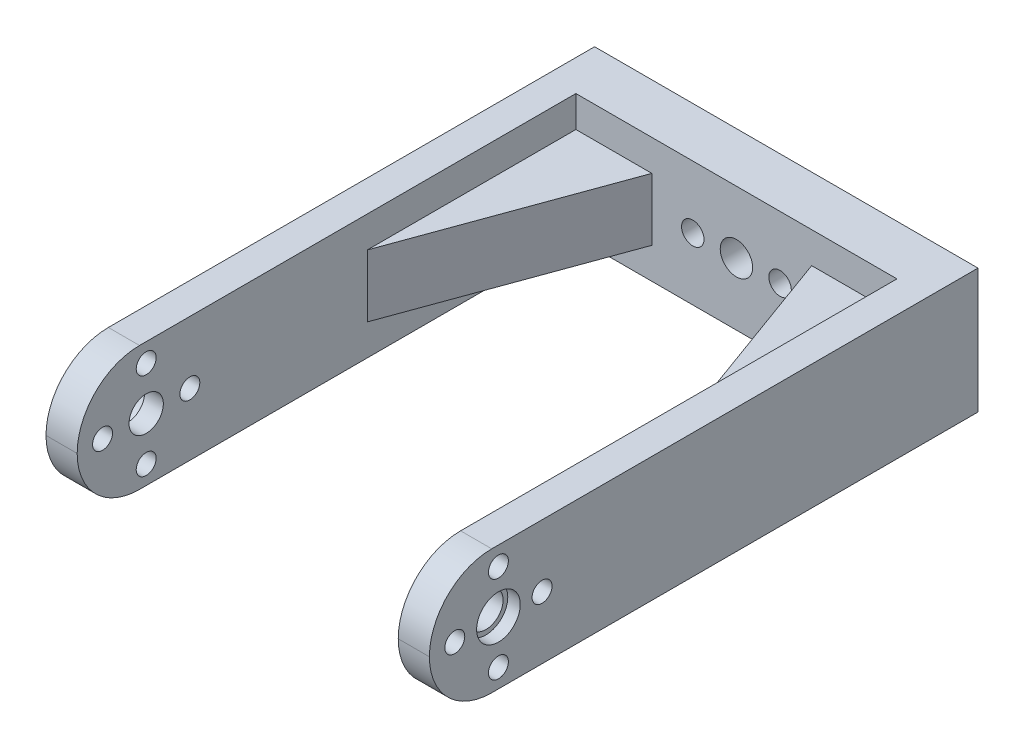
ISO-10303-21;
HEADER;
FILE_DESCRIPTION(('STEP AP214'),'2;1');
FILE_NAME('part.step','',(''),(''),'','','');
FILE_SCHEMA(('AUTOMOTIVE_DESIGN { 1 0 10303 214 1 1 1 1 }'));
ENDSEC;
DATA;
#1=APPLICATION_CONTEXT('core data for automotive mechanical design processes');
#2=APPLICATION_PROTOCOL_DEFINITION('international standard','automotive_design',2000,#1);
#3=PRODUCT_CONTEXT('',#1,'mechanical');
#4=PRODUCT('Part','Part','',(#3));
#5=PRODUCT_RELATED_PRODUCT_CATEGORY('part','',(#4));
#6=PRODUCT_DEFINITION_FORMATION('','',#4);
#7=PRODUCT_DEFINITION_CONTEXT('part definition',#1,'design');
#8=PRODUCT_DEFINITION('design','',#6,#7);
#9=PRODUCT_DEFINITION_SHAPE('','',#8);
#10=(LENGTH_UNIT() NAMED_UNIT(*) SI_UNIT(.MILLI.,.METRE.));
#11=(NAMED_UNIT(*) PLANE_ANGLE_UNIT() SI_UNIT($,.RADIAN.));
#12=(NAMED_UNIT(*) SI_UNIT($,.STERADIAN.) SOLID_ANGLE_UNIT());
#13=UNCERTAINTY_MEASURE_WITH_UNIT(LENGTH_MEASURE(1.E-05),#10,'distance_accuracy_value','');
#14=(GEOMETRIC_REPRESENTATION_CONTEXT(3) GLOBAL_UNCERTAINTY_ASSIGNED_CONTEXT((#13)) GLOBAL_UNIT_ASSIGNED_CONTEXT((#10,
#11,#12)) REPRESENTATION_CONTEXT('',''));
#15=CARTESIAN_POINT('',(0.,0.,0.));
#16=DIRECTION('',(0.,0.,1.));
#17=DIRECTION('',(1.,0.,0.));
#18=AXIS2_PLACEMENT_3D('',#15,#16,#17);
#19=CARTESIAN_POINT('',(-23.5,10.,68.9278748806243));
#20=DIRECTION('',(1.,0.,0.));
#21=DIRECTION('',(0.,0.,-1.));
#22=AXIS2_PLACEMENT_3D('',#19,#20,#21);
#23=CYLINDRICAL_SURFACE('',#22,2.75000000000001);
#24=CARTESIAN_POINT('',(5.,10.,68.9278748806243));
#25=DIRECTION('',(1.,0.,0.));
#26=DIRECTION('',(0.,1.,0.));
#27=AXIS2_PLACEMENT_3D('',#24,#25,#26);
#28=CIRCLE('',#27,2.75000000000001);
#29=CARTESIAN_POINT('',(5.,12.75,68.9278748806243));
#30=VERTEX_POINT('',#29);
#31=EDGE_CURVE('E258',#30,#30,#28,.T.);
#32=ORIENTED_EDGE('',*,*,#31,.T.);
#33=EDGE_LOOP('',(#32));
#34=FACE_BOUND('',#33,.T.);
#35=CARTESIAN_POINT('',(2.,10.,68.9278748806243));
#36=DIRECTION('',(-1.,0.,0.));
#37=DIRECTION('',(0.,0.,1.));
#38=AXIS2_PLACEMENT_3D('',#35,#36,#37);
#39=CIRCLE('',#38,2.75000000000001);
#40=CARTESIAN_POINT('',(2.,10.,71.6778748806243));
#41=VERTEX_POINT('',#40);
#42=EDGE_CURVE('E49',#41,#41,#39,.F.);
#43=ORIENTED_EDGE('',*,*,#42,.F.);
#44=EDGE_LOOP('',(#43));
#45=FACE_BOUND('',#44,.T.);
#46=ADVANCED_FACE('F45',(#34,#45),#23,.F.);
#47=CARTESIAN_POINT('',(56.5,10.,68.9278748806243));
#48=DIRECTION('',(1.,0.,0.));
#49=DIRECTION('',(0.,0.,-1.));
#50=AXIS2_PLACEMENT_3D('',#47,#48,#49);
#51=CIRCLE('',#50,2.75000000000001);
#52=CARTESIAN_POINT('',(56.5,10.,66.1778748806243));
#53=VERTEX_POINT('',#52);
#54=EDGE_CURVE('E257',#53,#53,#51,.T.);
#55=ORIENTED_EDGE('',*,*,#54,.F.);
#56=EDGE_LOOP('',(#55));
#57=FACE_BOUND('',#56,.T.);
#58=CARTESIAN_POINT('',(59.5,10.,68.9278748806243));
#59=DIRECTION('',(1.,0.,0.));
#60=DIRECTION('',(0.,0.,-1.));
#61=AXIS2_PLACEMENT_3D('',#58,#59,#60);
#62=CIRCLE('',#61,2.75000000000001);
#63=CARTESIAN_POINT('',(59.5,10.,66.1778748806243));
#64=VERTEX_POINT('',#63);
#65=EDGE_CURVE('E174',#64,#64,#62,.F.);
#66=ORIENTED_EDGE('',*,*,#65,.F.);
#67=EDGE_LOOP('',(#66));
#68=FACE_BOUND('',#67,.T.);
#69=ADVANCED_FACE('F376',(#57,#68),#23,.F.);
#70=CARTESIAN_POINT('',(0.,0.,0.));
#71=DIRECTION('',(0.,0.,-1.));
#72=DIRECTION('',(-1.,0.,0.));
#73=AXIS2_PLACEMENT_3D('',#70,#71,#72);
#74=PLANE('',#73);
#75=CARTESIAN_POINT('',(37.75,10.,0.));
#76=DIRECTION('',(0.,0.,-1.));
#77=DIRECTION('',(-1.,0.,0.));
#78=AXIS2_PLACEMENT_3D('',#75,#76,#77);
#79=CIRCLE('',#78,1.8);
#80=CARTESIAN_POINT('',(35.95,10.,0.));
#81=VERTEX_POINT('',#80);
#82=EDGE_CURVE('E254',#81,#81,#79,.T.);
#83=ORIENTED_EDGE('',*,*,#82,.T.);
#84=EDGE_LOOP('',(#83));
#85=FACE_BOUND('',#84,.T.);
#86=CARTESIAN_POINT('',(30.75,10.,0.));
#87=DIRECTION('',(0.,0.,-1.));
#88=DIRECTION('',(-1.,0.,0.));
#89=AXIS2_PLACEMENT_3D('',#86,#87,#88);
#90=CIRCLE('',#89,2.6);
#91=CARTESIAN_POINT('',(28.15,10.,0.));
#92=VERTEX_POINT('',#91);
#93=EDGE_CURVE('E248',#92,#92,#90,.T.);
#94=ORIENTED_EDGE('',*,*,#93,.T.);
#95=EDGE_LOOP('',(#94));
#96=FACE_BOUND('',#95,.T.);
#97=DIRECTION('',(0.,-1.,0.));
#98=VECTOR('',#97,1.);
#99=CARTESIAN_POINT('',(17.1808057330266,0.,0.));
#100=LINE('',#99,#98);
#101=CARTESIAN_POINT('',(17.1808057330266,15.,0.));
#102=VERTEX_POINT('',#101);
#103=CARTESIAN_POINT('',(17.1808057330266,5.,0.));
#104=VERTEX_POINT('',#103);
#105=EDGE_CURVE('E162',#102,#104,#100,.T.);
#106=ORIENTED_EDGE('',*,*,#105,.T.);
#107=DIRECTION('',(-1.,0.,0.));
#108=VECTOR('',#107,1.);
#109=CARTESIAN_POINT('',(0.,5.,0.));
#110=LINE('',#109,#108);
#111=CARTESIAN_POINT('',(5.,5.,0.));
#112=VERTEX_POINT('',#111);
#113=EDGE_CURVE('E170',#104,#112,#110,.T.);
#114=ORIENTED_EDGE('',*,*,#113,.T.);
#115=DIRECTION('',(0.,-1.,0.));
#116=VECTOR('',#115,1.);
#117=CARTESIAN_POINT('',(5.,0.,0.));
#118=LINE('',#117,#116);
#119=CARTESIAN_POINT('',(5.,0.,0.));
#120=VERTEX_POINT('',#119);
#121=EDGE_CURVE('E291',#112,#120,#118,.T.);
#122=ORIENTED_EDGE('',*,*,#121,.T.);
#123=DIRECTION('',(1.,0.,0.));
#124=VECTOR('',#123,1.);
#125=CARTESIAN_POINT('',(0.,0.,0.));
#126=LINE('',#125,#124);
#127=CARTESIAN_POINT('',(56.5,0.,0.));
#128=VERTEX_POINT('',#127);
#129=EDGE_CURVE('E273',#120,#128,#126,.T.);
#130=ORIENTED_EDGE('',*,*,#129,.T.);
#131=DIRECTION('',(0.,-1.,0.));
#132=VECTOR('',#131,1.);
#133=CARTESIAN_POINT('',(56.5,0.,0.));
#134=LINE('',#133,#132);
#135=CARTESIAN_POINT('',(56.5,5.,0.));
#136=VERTEX_POINT('',#135);
#137=EDGE_CURVE('E261',#136,#128,#134,.T.);
#138=ORIENTED_EDGE('',*,*,#137,.F.);
#139=DIRECTION('',(-1.,0.,0.));
#140=VECTOR('',#139,1.);
#141=CARTESIAN_POINT('',(0.,5.,0.));
#142=LINE('',#141,#140);
#143=CARTESIAN_POINT('',(42.8191942669734,5.,0.));
#144=VERTEX_POINT('',#143);
#145=EDGE_CURVE('E70',#136,#144,#142,.T.);
#146=ORIENTED_EDGE('',*,*,#145,.T.);
#147=DIRECTION('',(0.,-1.,0.));
#148=VECTOR('',#147,1.);
#149=CARTESIAN_POINT('',(42.8191942669734,0.,0.));
#150=LINE('',#149,#148);
#151=CARTESIAN_POINT('',(42.8191942669734,15.,0.));
#152=VERTEX_POINT('',#151);
#153=EDGE_CURVE('E195',#144,#152,#150,.F.);
#154=ORIENTED_EDGE('',*,*,#153,.T.);
#155=DIRECTION('',(-1.,0.,0.));
#156=VECTOR('',#155,1.);
#157=CARTESIAN_POINT('',(0.,15.,0.));
#158=LINE('',#157,#156);
#159=CARTESIAN_POINT('',(56.5,15.,0.));
#160=VERTEX_POINT('',#159);
#161=EDGE_CURVE('E189',#160,#152,#158,.T.);
#162=ORIENTED_EDGE('',*,*,#161,.F.);
#163=CARTESIAN_POINT('',(56.5,20.,0.));
#164=VERTEX_POINT('',#163);
#165=EDGE_CURVE('E262',#164,#160,#134,.T.);
#166=ORIENTED_EDGE('',*,*,#165,.F.);
#167=DIRECTION('',(1.,0.,0.));
#168=VECTOR('',#167,1.);
#169=CARTESIAN_POINT('',(0.,20.,0.));
#170=LINE('',#169,#168);
#171=CARTESIAN_POINT('',(5.,20.,0.));
#172=VERTEX_POINT('',#171);
#173=EDGE_CURVE('E269',#172,#164,#170,.T.);
#174=ORIENTED_EDGE('',*,*,#173,.F.);
#175=CARTESIAN_POINT('',(5.,15.,0.));
#176=VERTEX_POINT('',#175);
#177=EDGE_CURVE('E181',#172,#176,#118,.T.);
#178=ORIENTED_EDGE('',*,*,#177,.T.);
#179=DIRECTION('',(-1.,0.,0.));
#180=VECTOR('',#179,1.);
#181=CARTESIAN_POINT('',(0.,15.,0.));
#182=LINE('',#181,#180);
#183=EDGE_CURVE('E62',#102,#176,#182,.T.);
#184=ORIENTED_EDGE('',*,*,#183,.F.);
#185=EDGE_LOOP('',(#106,#114,#122,#130,#138,#146,#154,#162,#166,#174,#178,#184));
#186=FACE_BOUND('',#185,.T.);
#187=CARTESIAN_POINT('',(23.75,10.,0.));
#188=DIRECTION('',(0.,0.,-1.));
#189=DIRECTION('',(-1.,0.,0.));
#190=AXIS2_PLACEMENT_3D('',#187,#188,#189);
#191=CIRCLE('',#190,1.8);
#192=CARTESIAN_POINT('',(21.95,10.,0.));
#193=VERTEX_POINT('',#192);
#194=EDGE_CURVE('E251',#193,#193,#191,.F.);
#195=ORIENTED_EDGE('',*,*,#194,.F.);
#196=EDGE_LOOP('',(#195));
#197=FACE_BOUND('',#196,.T.);
#198=ADVANCED_FACE('F177',(#85,#96,#186,#197),#74,.F.);
#199=CARTESIAN_POINT('',(0.,0.,-8.));
#200=DIRECTION('',(0.,0.,-1.));
#201=DIRECTION('',(-1.,0.,0.));
#202=AXIS2_PLACEMENT_3D('',#199,#200,#201);
#203=PLANE('',#202);
#204=DIRECTION('',(0.,1.,0.));
#205=VECTOR('',#204,1.);
#206=CARTESIAN_POINT('',(0.,0.,-8.));
#207=LINE('',#206,#205);
#208=CARTESIAN_POINT('',(0.,0.,-8.));
#209=VERTEX_POINT('',#208);
#210=CARTESIAN_POINT('',(0.,20.,-8.));
#211=VERTEX_POINT('',#210);
#212=EDGE_CURVE('E270',#209,#211,#207,.T.);
#213=ORIENTED_EDGE('',*,*,#212,.T.);
#214=DIRECTION('',(1.,0.,0.));
#215=VECTOR('',#214,1.);
#216=CARTESIAN_POINT('',(0.,20.,-8.));
#217=LINE('',#216,#215);
#218=CARTESIAN_POINT('',(61.5,20.,-8.));
#219=VERTEX_POINT('',#218);
#220=EDGE_CURVE('E272',#211,#219,#217,.T.);
#221=ORIENTED_EDGE('',*,*,#220,.T.);
#222=DIRECTION('',(0.,1.,0.));
#223=VECTOR('',#222,1.);
#224=CARTESIAN_POINT('',(61.5,0.,-8.));
#225=LINE('',#224,#223);
#226=CARTESIAN_POINT('',(61.5,0.,-8.));
#227=VERTEX_POINT('',#226);
#228=EDGE_CURVE('E276',#227,#219,#225,.T.);
#229=ORIENTED_EDGE('',*,*,#228,.F.);
#230=DIRECTION('',(1.,0.,0.));
#231=VECTOR('',#230,1.);
#232=CARTESIAN_POINT('',(0.,0.,-8.));
#233=LINE('',#232,#231);
#234=EDGE_CURVE('E278',#209,#227,#233,.T.);
#235=ORIENTED_EDGE('',*,*,#234,.F.);
#236=EDGE_LOOP('',(#213,#221,#229,#235));
#237=FACE_BOUND('',#236,.T.);
#238=CARTESIAN_POINT('',(37.75,10.,-8.));
#239=DIRECTION('',(0.,0.,-1.));
#240=DIRECTION('',(-1.,0.,0.));
#241=AXIS2_PLACEMENT_3D('',#238,#239,#240);
#242=CIRCLE('',#241,1.8);
#243=CARTESIAN_POINT('',(35.95,10.,-8.));
#244=VERTEX_POINT('',#243);
#245=EDGE_CURVE('E242',#244,#244,#242,.T.);
#246=ORIENTED_EDGE('',*,*,#245,.F.);
#247=EDGE_LOOP('',(#246));
#248=FACE_BOUND('',#247,.T.);
#249=CARTESIAN_POINT('',(30.75,10.,-8.));
#250=DIRECTION('',(0.,0.,-1.));
#251=DIRECTION('',(-1.,0.,0.));
#252=AXIS2_PLACEMENT_3D('',#249,#250,#251);
#253=CIRCLE('',#252,2.6);
#254=CARTESIAN_POINT('',(28.15,10.,-8.));
#255=VERTEX_POINT('',#254);
#256=EDGE_CURVE('E241',#255,#255,#253,.T.);
#257=ORIENTED_EDGE('',*,*,#256,.F.);
#258=EDGE_LOOP('',(#257));
#259=FACE_BOUND('',#258,.T.);
#260=CARTESIAN_POINT('',(23.75,10.,-8.));
#261=DIRECTION('',(0.,0.,-1.));
#262=DIRECTION('',(-1.,0.,0.));
#263=AXIS2_PLACEMENT_3D('',#260,#261,#262);
#264=CIRCLE('',#263,1.8);
#265=CARTESIAN_POINT('',(21.95,10.,-8.));
#266=VERTEX_POINT('',#265);
#267=EDGE_CURVE('E238',#266,#266,#264,.F.);
#268=ORIENTED_EDGE('',*,*,#267,.T.);
#269=EDGE_LOOP('',(#268));
#270=FACE_BOUND('',#269,.T.);
#271=ADVANCED_FACE('F394',(#237,#248,#259,#270),#203,.T.);
#272=CARTESIAN_POINT('',(0.,20.,80.));
#273=DIRECTION('',(0.,1.,0.));
#274=DIRECTION('',(0.,0.,1.));
#275=AXIS2_PLACEMENT_3D('',#272,#273,#274);
#276=PLANE('',#275);
#277=DIRECTION('',(0.,0.,-1.));
#278=VECTOR('',#277,1.);
#279=CARTESIAN_POINT('',(0.,20.,80.));
#280=LINE('',#279,#278);
#281=CARTESIAN_POINT('',(0.,20.,70.));
#282=VERTEX_POINT('',#281);
#283=EDGE_CURVE('E300',#282,#211,#280,.T.);
#284=ORIENTED_EDGE('',*,*,#283,.F.);
#285=DIRECTION('',(1.,0.,0.));
#286=VECTOR('',#285,1.);
#287=CARTESIAN_POINT('',(0.,20.,70.));
#288=LINE('',#287,#286);
#289=CARTESIAN_POINT('',(5.,20.,70.));
#290=VERTEX_POINT('',#289);
#291=EDGE_CURVE('E307',#282,#290,#288,.T.);
#292=ORIENTED_EDGE('',*,*,#291,.T.);
#293=DIRECTION('',(0.,0.,-1.));
#294=VECTOR('',#293,1.);
#295=CARTESIAN_POINT('',(5.,20.,80.));
#296=LINE('',#295,#294);
#297=EDGE_CURVE('E293',#290,#172,#296,.T.);
#298=ORIENTED_EDGE('',*,*,#297,.T.);
#299=ORIENTED_EDGE('',*,*,#173,.T.);
#300=DIRECTION('',(0.,0.,-1.));
#301=VECTOR('',#300,1.);
#302=CARTESIAN_POINT('',(56.5,20.,80.));
#303=LINE('',#302,#301);
#304=CARTESIAN_POINT('',(56.5,20.,70.));
#305=VERTEX_POINT('',#304);
#306=EDGE_CURVE('E267',#305,#164,#303,.T.);
#307=ORIENTED_EDGE('',*,*,#306,.F.);
#308=DIRECTION('',(1.,0.,0.));
#309=VECTOR('',#308,1.);
#310=CARTESIAN_POINT('',(0.,20.,70.));
#311=LINE('',#310,#309);
#312=CARTESIAN_POINT('',(61.5,20.,70.));
#313=VERTEX_POINT('',#312);
#314=EDGE_CURVE('E303',#305,#313,#311,.T.);
#315=ORIENTED_EDGE('',*,*,#314,.T.);
#316=DIRECTION('',(0.,0.,1.));
#317=VECTOR('',#316,1.);
#318=CARTESIAN_POINT('',(61.5,20.,-8.));
#319=LINE('',#318,#317);
#320=EDGE_CURVE('E288',#219,#313,#319,.T.);
#321=ORIENTED_EDGE('',*,*,#320,.F.);
#322=ORIENTED_EDGE('',*,*,#220,.F.);
#323=EDGE_LOOP('',(#284,#292,#298,#299,#307,#315,#321,#322));
#324=FACE_BOUND('',#323,.T.);
#325=ADVANCED_FACE('F397',(#324),#276,.T.);
#326=CARTESIAN_POINT('',(0.,0.,80.));
#327=DIRECTION('',(-1.,0.,0.));
#328=DIRECTION('',(0.,0.,1.));
#329=AXIS2_PLACEMENT_3D('',#326,#327,#328);
#330=PLANE('',#329);
#331=CARTESIAN_POINT('',(0.,10.,68.9278748806243));
#332=DIRECTION('',(-1.,0.,0.));
#333=DIRECTION('',(0.,0.,1.));
#334=AXIS2_PLACEMENT_3D('',#331,#332,#333);
#335=CIRCLE('',#334,3.50000000000001);
#336=CARTESIAN_POINT('',(0.,10.,72.4278748806243));
#337=VERTEX_POINT('',#336);
#338=EDGE_CURVE('E363',#337,#337,#335,.T.);
#339=ORIENTED_EDGE('',*,*,#338,.F.);
#340=EDGE_LOOP('',(#339));
#341=FACE_BOUND('',#340,.T.);
#342=ORIENTED_EDGE('',*,*,#283,.T.);
#343=ORIENTED_EDGE('',*,*,#212,.F.);
#344=DIRECTION('',(0.,0.,-1.));
#345=VECTOR('',#344,1.);
#346=CARTESIAN_POINT('',(0.,0.,80.));
#347=LINE('',#346,#345);
#348=CARTESIAN_POINT('',(0.,0.,70.));
#349=VERTEX_POINT('',#348);
#350=EDGE_CURVE('E298',#349,#209,#347,.T.);
#351=ORIENTED_EDGE('',*,*,#350,.F.);
#352=CARTESIAN_POINT('',(0.,10.,70.));
#353=DIRECTION('',(-1.,0.,0.));
#354=DIRECTION('',(0.,0.,1.));
#355=AXIS2_PLACEMENT_3D('',#352,#353,#354);
#356=CIRCLE('',#355,10.);
#357=CARTESIAN_POINT('',(0.,10.,80.));
#358=VERTEX_POINT('',#357);
#359=EDGE_CURVE('E314',#349,#358,#356,.T.);
#360=ORIENTED_EDGE('',*,*,#359,.T.);
#361=CARTESIAN_POINT('',(0.,10.,70.));
#362=DIRECTION('',(-1.,0.,0.));
#363=DIRECTION('',(0.,0.,1.));
#364=AXIS2_PLACEMENT_3D('',#361,#362,#363);
#365=CIRCLE('',#364,10.);
#366=EDGE_CURVE('E316',#358,#282,#365,.T.);
#367=ORIENTED_EDGE('',*,*,#366,.T.);
#368=EDGE_LOOP('',(#342,#343,#351,#360,#367));
#369=FACE_BOUND('',#368,.T.);
#370=CARTESIAN_POINT('',(0.,10.,75.9278748806243));
#371=DIRECTION('',(1.,0.,0.));
#372=DIRECTION('',(0.,0.,-1.));
#373=AXIS2_PLACEMENT_3D('',#370,#371,#372);
#374=CIRCLE('',#373,1.6);
#375=CARTESIAN_POINT('',(0.,10.,74.3278748806243));
#376=VERTEX_POINT('',#375);
#377=EDGE_CURVE('E202',#376,#376,#374,.T.);
#378=ORIENTED_EDGE('',*,*,#377,.T.);
#379=EDGE_LOOP('',(#378));
#380=FACE_BOUND('',#379,.T.);
#381=CARTESIAN_POINT('',(0.,17.,68.9278748806243));
#382=DIRECTION('',(1.,0.,0.));
#383=DIRECTION('',(0.,0.,-1.));
#384=AXIS2_PLACEMENT_3D('',#381,#382,#383);
#385=CIRCLE('',#384,1.6);
#386=CARTESIAN_POINT('',(0.,17.,67.3278748806243));
#387=VERTEX_POINT('',#386);
#388=EDGE_CURVE('E205',#387,#387,#385,.T.);
#389=ORIENTED_EDGE('',*,*,#388,.T.);
#390=EDGE_LOOP('',(#389));
#391=FACE_BOUND('',#390,.T.);
#392=CARTESIAN_POINT('',(0.,10.,61.9278748806243));
#393=DIRECTION('',(1.,0.,0.));
#394=DIRECTION('',(0.,0.,-1.));
#395=AXIS2_PLACEMENT_3D('',#392,#393,#394);
#396=CIRCLE('',#395,1.6);
#397=CARTESIAN_POINT('',(0.,10.,60.3278748806243));
#398=VERTEX_POINT('',#397);
#399=EDGE_CURVE('E211',#398,#398,#396,.T.);
#400=ORIENTED_EDGE('',*,*,#399,.T.);
#401=EDGE_LOOP('',(#400));
#402=FACE_BOUND('',#401,.T.);
#403=CARTESIAN_POINT('',(0.,3.,68.9278748806243));
#404=DIRECTION('',(1.,0.,0.));
#405=DIRECTION('',(0.,0.,-1.));
#406=AXIS2_PLACEMENT_3D('',#403,#404,#405);
#407=CIRCLE('',#406,1.60000000000001);
#408=CARTESIAN_POINT('',(0.,3.,67.3278748806243));
#409=VERTEX_POINT('',#408);
#410=EDGE_CURVE('E217',#409,#409,#407,.T.);
#411=ORIENTED_EDGE('',*,*,#410,.T.);
#412=EDGE_LOOP('',(#411));
#413=FACE_BOUND('',#412,.T.);
#414=ADVANCED_FACE('F412',(#341,#369,#380,#391,#402,#413),#330,.T.);
#415=CARTESIAN_POINT('',(0.,0.,80.));
#416=DIRECTION('',(0.,1.,0.));
#417=DIRECTION('',(0.,0.,1.));
#418=AXIS2_PLACEMENT_3D('',#415,#416,#417);
#419=PLANE('',#418);
#420=DIRECTION('',(0.,0.,-1.));
#421=VECTOR('',#420,1.);
#422=CARTESIAN_POINT('',(5.,0.,80.));
#423=LINE('',#422,#421);
#424=CARTESIAN_POINT('',(5.,0.,70.));
#425=VERTEX_POINT('',#424);
#426=EDGE_CURVE('E295',#425,#120,#423,.T.);
#427=ORIENTED_EDGE('',*,*,#426,.F.);
#428=DIRECTION('',(1.,0.,0.));
#429=VECTOR('',#428,1.);
#430=CARTESIAN_POINT('',(0.,0.,70.));
#431=LINE('',#430,#429);
#432=EDGE_CURVE('E321',#425,#349,#431,.F.);
#433=ORIENTED_EDGE('',*,*,#432,.T.);
#434=ORIENTED_EDGE('',*,*,#350,.T.);
#435=ORIENTED_EDGE('',*,*,#234,.T.);
#436=DIRECTION('',(0.,0.,1.));
#437=VECTOR('',#436,1.);
#438=CARTESIAN_POINT('',(61.5,0.,-8.));
#439=LINE('',#438,#437);
#440=CARTESIAN_POINT('',(61.5,0.,70.));
#441=VERTEX_POINT('',#440);
#442=EDGE_CURVE('E281',#227,#441,#439,.T.);
#443=ORIENTED_EDGE('',*,*,#442,.T.);
#444=DIRECTION('',(1.,0.,0.));
#445=VECTOR('',#444,1.);
#446=CARTESIAN_POINT('',(56.5,0.,70.));
#447=LINE('',#446,#445);
#448=CARTESIAN_POINT('',(56.5,0.,70.));
#449=VERTEX_POINT('',#448);
#450=EDGE_CURVE('E318',#441,#449,#447,.F.);
#451=ORIENTED_EDGE('',*,*,#450,.T.);
#452=DIRECTION('',(0.,0.,-1.));
#453=VECTOR('',#452,1.);
#454=CARTESIAN_POINT('',(56.5,0.,80.));
#455=LINE('',#454,#453);
#456=EDGE_CURVE('E264',#449,#128,#455,.T.);
#457=ORIENTED_EDGE('',*,*,#456,.T.);
#458=ORIENTED_EDGE('',*,*,#129,.F.);
#459=EDGE_LOOP('',(#427,#433,#434,#435,#443,#451,#457,#458));
#460=FACE_BOUND('',#459,.T.);
#461=ADVANCED_FACE('F408',(#460),#419,.F.);
#462=CARTESIAN_POINT('',(5.,0.,80.));
#463=DIRECTION('',(1.,0.,0.));
#464=DIRECTION('',(0.,1.,0.));
#465=AXIS2_PLACEMENT_3D('',#462,#463,#464);
#466=PLANE('',#465);
#467=DIRECTION('',(0.,0.,-1.));
#468=VECTOR('',#467,1.);
#469=CARTESIAN_POINT('',(5.,5.,80.));
#470=LINE('',#469,#468);
#471=CARTESIAN_POINT('',(5.00000000000001,5.,33.4664887022544));
#472=VERTEX_POINT('',#471);
#473=EDGE_CURVE('E11',#472,#112,#470,.T.);
#474=ORIENTED_EDGE('',*,*,#473,.F.);
#475=DIRECTION('',(0.,-1.,0.));
#476=VECTOR('',#475,1.);
#477=CARTESIAN_POINT('',(5.,0.,33.4664887022544));
#478=LINE('',#477,#476);
#479=CARTESIAN_POINT('',(5.00000000000001,15.,33.4664887022544));
#480=VERTEX_POINT('',#479);
#481=EDGE_CURVE('E54',#480,#472,#478,.T.);
#482=ORIENTED_EDGE('',*,*,#481,.F.);
#483=DIRECTION('',(0.,0.,-1.));
#484=VECTOR('',#483,1.);
#485=CARTESIAN_POINT('',(5.,15.,80.));
#486=LINE('',#485,#484);
#487=EDGE_CURVE('E173',#480,#176,#486,.T.);
#488=ORIENTED_EDGE('',*,*,#487,.T.);
#489=ORIENTED_EDGE('',*,*,#177,.F.);
#490=ORIENTED_EDGE('',*,*,#297,.F.);
#491=CARTESIAN_POINT('',(5.,10.,70.));
#492=DIRECTION('',(1.,0.,0.));
#493=DIRECTION('',(0.,1.,0.));
#494=AXIS2_PLACEMENT_3D('',#491,#492,#493);
#495=CIRCLE('',#494,10.);
#496=CARTESIAN_POINT('',(5.,10.,80.));
#497=VERTEX_POINT('',#496);
#498=EDGE_CURVE('E312',#290,#497,#495,.T.);
#499=ORIENTED_EDGE('',*,*,#498,.T.);
#500=CARTESIAN_POINT('',(5.,10.,70.));
#501=DIRECTION('',(1.,0.,0.));
#502=DIRECTION('',(0.,1.,0.));
#503=AXIS2_PLACEMENT_3D('',#500,#501,#502);
#504=CIRCLE('',#503,10.);
#505=EDGE_CURVE('E310',#497,#425,#504,.T.);
#506=ORIENTED_EDGE('',*,*,#505,.T.);
#507=ORIENTED_EDGE('',*,*,#426,.T.);
#508=ORIENTED_EDGE('',*,*,#121,.F.);
#509=EDGE_LOOP('',(#474,#482,#488,#489,#490,#499,#506,#507,#508));
#510=FACE_BOUND('',#509,.T.);
#511=CARTESIAN_POINT('',(5.,10.,75.9278748806243));
#512=DIRECTION('',(1.,0.,0.));
#513=DIRECTION('',(0.,1.,0.));
#514=AXIS2_PLACEMENT_3D('',#511,#512,#513);
#515=CIRCLE('',#514,1.6);
#516=CARTESIAN_POINT('',(5.,11.6,75.9278748806243));
#517=VERTEX_POINT('',#516);
#518=EDGE_CURVE('E234',#517,#517,#515,.F.);
#519=ORIENTED_EDGE('',*,*,#518,.T.);
#520=EDGE_LOOP('',(#519));
#521=FACE_BOUND('',#520,.T.);
#522=CARTESIAN_POINT('',(5.,17.,68.9278748806243));
#523=DIRECTION('',(1.,0.,0.));
#524=DIRECTION('',(0.,1.,0.));
#525=AXIS2_PLACEMENT_3D('',#522,#523,#524);
#526=CIRCLE('',#525,1.6);
#527=CARTESIAN_POINT('',(5.,18.6,68.9278748806243));
#528=VERTEX_POINT('',#527);
#529=EDGE_CURVE('E230',#528,#528,#526,.F.);
#530=ORIENTED_EDGE('',*,*,#529,.T.);
#531=EDGE_LOOP('',(#530));
#532=FACE_BOUND('',#531,.T.);
#533=CARTESIAN_POINT('',(5.,10.,61.9278748806243));
#534=DIRECTION('',(1.,0.,0.));
#535=DIRECTION('',(0.,1.,0.));
#536=AXIS2_PLACEMENT_3D('',#533,#534,#535);
#537=CIRCLE('',#536,1.6);
#538=CARTESIAN_POINT('',(5.,11.6,61.9278748806243));
#539=VERTEX_POINT('',#538);
#540=EDGE_CURVE('E226',#539,#539,#537,.F.);
#541=ORIENTED_EDGE('',*,*,#540,.T.);
#542=EDGE_LOOP('',(#541));
#543=FACE_BOUND('',#542,.T.);
#544=CARTESIAN_POINT('',(5.,3.,68.9278748806243));
#545=DIRECTION('',(1.,0.,0.));
#546=DIRECTION('',(0.,1.,0.));
#547=AXIS2_PLACEMENT_3D('',#544,#545,#546);
#548=CIRCLE('',#547,1.60000000000001);
#549=CARTESIAN_POINT('',(5.,4.6,68.9278748806243));
#550=VERTEX_POINT('',#549);
#551=EDGE_CURVE('E222',#550,#550,#548,.F.);
#552=ORIENTED_EDGE('',*,*,#551,.T.);
#553=EDGE_LOOP('',(#552));
#554=FACE_BOUND('',#553,.T.);
#555=ORIENTED_EDGE('',*,*,#31,.F.);
#556=EDGE_LOOP('',(#555));
#557=FACE_BOUND('',#556,.T.);
#558=ADVANCED_FACE('F404',(#510,#521,#532,#543,#554,#557),#466,.T.);
#559=CARTESIAN_POINT('',(61.5,0.,-8.));
#560=DIRECTION('',(1.,0.,0.));
#561=DIRECTION('',(0.,0.,-1.));
#562=AXIS2_PLACEMENT_3D('',#559,#560,#561);
#563=PLANE('',#562);
#564=CARTESIAN_POINT('',(61.5,10.,68.9278748806243));
#565=DIRECTION('',(1.,0.,0.));
#566=DIRECTION('',(0.,0.,-1.));
#567=AXIS2_PLACEMENT_3D('',#564,#565,#566);
#568=CIRCLE('',#567,3.50000000000001);
#569=CARTESIAN_POINT('',(61.5,10.,65.4278748806243));
#570=VERTEX_POINT('',#569);
#571=EDGE_CURVE('E356',#570,#570,#568,.T.);
#572=ORIENTED_EDGE('',*,*,#571,.F.);
#573=EDGE_LOOP('',(#572));
#574=FACE_BOUND('',#573,.T.);
#575=ORIENTED_EDGE('',*,*,#228,.T.);
#576=ORIENTED_EDGE('',*,*,#320,.T.);
#577=CARTESIAN_POINT('',(61.5,10.,70.));
#578=DIRECTION('',(1.,0.,0.));
#579=DIRECTION('',(0.,0.,-1.));
#580=AXIS2_PLACEMENT_3D('',#577,#578,#579);
#581=CIRCLE('',#580,10.);
#582=CARTESIAN_POINT('',(61.5,10.,80.));
#583=VERTEX_POINT('',#582);
#584=EDGE_CURVE('E323',#313,#583,#581,.T.);
#585=ORIENTED_EDGE('',*,*,#584,.T.);
#586=CARTESIAN_POINT('',(61.5,10.,70.));
#587=DIRECTION('',(1.,0.,0.));
#588=DIRECTION('',(0.,0.,-1.));
#589=AXIS2_PLACEMENT_3D('',#586,#587,#588);
#590=CIRCLE('',#589,10.);
#591=EDGE_CURVE('E325',#583,#441,#590,.T.);
#592=ORIENTED_EDGE('',*,*,#591,.T.);
#593=ORIENTED_EDGE('',*,*,#442,.F.);
#594=EDGE_LOOP('',(#575,#576,#585,#592,#593));
#595=FACE_BOUND('',#594,.T.);
#596=CARTESIAN_POINT('',(61.5,10.,75.9278748806243));
#597=DIRECTION('',(1.,0.,0.));
#598=DIRECTION('',(0.,0.,-1.));
#599=AXIS2_PLACEMENT_3D('',#596,#597,#598);
#600=CIRCLE('',#599,1.6);
#601=CARTESIAN_POINT('',(61.5,10.,74.3278748806243));
#602=VERTEX_POINT('',#601);
#603=EDGE_CURVE('E198',#602,#602,#600,.T.);
#604=ORIENTED_EDGE('',*,*,#603,.F.);
#605=EDGE_LOOP('',(#604));
#606=FACE_BOUND('',#605,.T.);
#607=CARTESIAN_POINT('',(61.5,17.,68.9278748806243));
#608=DIRECTION('',(1.,0.,0.));
#609=DIRECTION('',(0.,0.,-1.));
#610=AXIS2_PLACEMENT_3D('',#607,#608,#609);
#611=CIRCLE('',#610,1.6);
#612=CARTESIAN_POINT('',(61.5,17.,67.3278748806243));
#613=VERTEX_POINT('',#612);
#614=EDGE_CURVE('E208',#613,#613,#611,.T.);
#615=ORIENTED_EDGE('',*,*,#614,.F.);
#616=EDGE_LOOP('',(#615));
#617=FACE_BOUND('',#616,.T.);
#618=CARTESIAN_POINT('',(61.5,10.,61.9278748806243));
#619=DIRECTION('',(1.,0.,0.));
#620=DIRECTION('',(0.,0.,-1.));
#621=AXIS2_PLACEMENT_3D('',#618,#619,#620);
#622=CIRCLE('',#621,1.6);
#623=CARTESIAN_POINT('',(61.5,10.,60.3278748806243));
#624=VERTEX_POINT('',#623);
#625=EDGE_CURVE('E214',#624,#624,#622,.T.);
#626=ORIENTED_EDGE('',*,*,#625,.F.);
#627=EDGE_LOOP('',(#626));
#628=FACE_BOUND('',#627,.T.);
#629=CARTESIAN_POINT('',(61.5,3.,68.9278748806243));
#630=DIRECTION('',(1.,0.,0.));
#631=DIRECTION('',(0.,0.,-1.));
#632=AXIS2_PLACEMENT_3D('',#629,#630,#631);
#633=CIRCLE('',#632,1.60000000000001);
#634=CARTESIAN_POINT('',(61.5,3.,67.3278748806243));
#635=VERTEX_POINT('',#634);
#636=EDGE_CURVE('E197',#635,#635,#633,.T.);
#637=ORIENTED_EDGE('',*,*,#636,.F.);
#638=EDGE_LOOP('',(#637));
#639=FACE_BOUND('',#638,.T.);
#640=ADVANCED_FACE('F392',(#574,#595,#606,#617,#628,#639),#563,.T.);
#641=CARTESIAN_POINT('',(56.5,0.,80.));
#642=DIRECTION('',(1.,0.,0.));
#643=DIRECTION('',(0.,0.,-1.));
#644=AXIS2_PLACEMENT_3D('',#641,#642,#643);
#645=PLANE('',#644);
#646=CARTESIAN_POINT('',(56.5,10.,75.9278748806243));
#647=DIRECTION('',(1.,0.,0.));
#648=DIRECTION('',(0.,0.,-1.));
#649=AXIS2_PLACEMENT_3D('',#646,#647,#648);
#650=CIRCLE('',#649,1.6);
#651=CARTESIAN_POINT('',(56.5,10.,74.3278748806243));
#652=VERTEX_POINT('',#651);
#653=EDGE_CURVE('E233',#652,#652,#650,.F.);
#654=ORIENTED_EDGE('',*,*,#653,.F.);
#655=EDGE_LOOP('',(#654));
#656=FACE_BOUND('',#655,.T.);
#657=CARTESIAN_POINT('',(56.5,17.,68.9278748806243));
#658=DIRECTION('',(1.,0.,0.));
#659=DIRECTION('',(0.,0.,-1.));
#660=AXIS2_PLACEMENT_3D('',#657,#658,#659);
#661=CIRCLE('',#660,1.6);
#662=CARTESIAN_POINT('',(56.5,17.,67.3278748806243));
#663=VERTEX_POINT('',#662);
#664=EDGE_CURVE('E229',#663,#663,#661,.F.);
#665=ORIENTED_EDGE('',*,*,#664,.F.);
#666=EDGE_LOOP('',(#665));
#667=FACE_BOUND('',#666,.T.);
#668=CARTESIAN_POINT('',(56.5,10.,61.9278748806243));
#669=DIRECTION('',(1.,0.,0.));
#670=DIRECTION('',(0.,0.,-1.));
#671=AXIS2_PLACEMENT_3D('',#668,#669,#670);
#672=CIRCLE('',#671,1.6);
#673=CARTESIAN_POINT('',(56.5,10.,60.3278748806243));
#674=VERTEX_POINT('',#673);
#675=EDGE_CURVE('E225',#674,#674,#672,.F.);
#676=ORIENTED_EDGE('',*,*,#675,.F.);
#677=EDGE_LOOP('',(#676));
#678=FACE_BOUND('',#677,.T.);
#679=CARTESIAN_POINT('',(56.5,3.,68.9278748806243));
#680=DIRECTION('',(1.,0.,0.));
#681=DIRECTION('',(0.,0.,-1.));
#682=AXIS2_PLACEMENT_3D('',#679,#680,#681);
#683=CIRCLE('',#682,1.60000000000001);
#684=CARTESIAN_POINT('',(56.5,3.,67.3278748806243));
#685=VERTEX_POINT('',#684);
#686=EDGE_CURVE('E201',#685,#685,#683,.F.);
#687=ORIENTED_EDGE('',*,*,#686,.F.);
#688=EDGE_LOOP('',(#687));
#689=FACE_BOUND('',#688,.T.);
#690=ORIENTED_EDGE('',*,*,#54,.T.);
#691=EDGE_LOOP('',(#690));
#692=FACE_BOUND('',#691,.T.);
#693=DIRECTION('',(0.,1.,0.));
#694=VECTOR('',#693,1.);
#695=CARTESIAN_POINT('',(56.5,0.,37.5877048314364));
#696=LINE('',#695,#694);
#697=CARTESIAN_POINT('',(56.5,15.,37.5877048314364));
#698=VERTEX_POINT('',#697);
#699=CARTESIAN_POINT('',(56.5,5.,37.5877048314364));
#700=VERTEX_POINT('',#699);
#701=EDGE_CURVE('E346',#698,#700,#696,.F.);
#702=ORIENTED_EDGE('',*,*,#701,.T.);
#703=DIRECTION('',(0.,0.,-1.));
#704=VECTOR('',#703,1.);
#705=CARTESIAN_POINT('',(56.5,5.,80.));
#706=LINE('',#705,#704);
#707=EDGE_CURVE('E348',#700,#136,#706,.T.);
#708=ORIENTED_EDGE('',*,*,#707,.T.);
#709=ORIENTED_EDGE('',*,*,#137,.T.);
#710=ORIENTED_EDGE('',*,*,#456,.F.);
#711=CARTESIAN_POINT('',(56.5,10.,70.));
#712=DIRECTION('',(1.,0.,0.));
#713=DIRECTION('',(0.,0.,-1.));
#714=AXIS2_PLACEMENT_3D('',#711,#712,#713);
#715=CIRCLE('',#714,10.);
#716=CARTESIAN_POINT('',(56.5,10.,80.));
#717=VERTEX_POINT('',#716);
#718=EDGE_CURVE('E329',#449,#717,#715,.F.);
#719=ORIENTED_EDGE('',*,*,#718,.T.);
#720=CARTESIAN_POINT('',(56.5,10.,70.));
#721=DIRECTION('',(1.,0.,0.));
#722=DIRECTION('',(0.,0.,-1.));
#723=AXIS2_PLACEMENT_3D('',#720,#721,#722);
#724=CIRCLE('',#723,10.);
#725=EDGE_CURVE('E327',#717,#305,#724,.F.);
#726=ORIENTED_EDGE('',*,*,#725,.T.);
#727=ORIENTED_EDGE('',*,*,#306,.T.);
#728=ORIENTED_EDGE('',*,*,#165,.T.);
#729=DIRECTION('',(0.,0.,-1.));
#730=VECTOR('',#729,1.);
#731=CARTESIAN_POINT('',(56.5,15.,80.));
#732=LINE('',#731,#730);
#733=EDGE_CURVE('E331',#698,#160,#732,.T.);
#734=ORIENTED_EDGE('',*,*,#733,.F.);
#735=EDGE_LOOP('',(#702,#708,#709,#710,#719,#726,#727,#728,#734));
#736=FACE_BOUND('',#735,.T.);
#737=ADVANCED_FACE('F389',(#656,#667,#678,#689,#692,#736),#645,.F.);
#738=CARTESIAN_POINT('',(30.75,10.,2.));
#739=DIRECTION('',(0.,0.,-1.));
#740=DIRECTION('',(-1.,0.,0.));
#741=AXIS2_PLACEMENT_3D('',#738,#739,#740);
#742=CYLINDRICAL_SURFACE('',#741,2.6);
#743=ORIENTED_EDGE('',*,*,#256,.T.);
#744=EDGE_LOOP('',(#743));
#745=FACE_BOUND('',#744,.T.);
#746=ORIENTED_EDGE('',*,*,#93,.F.);
#747=EDGE_LOOP('',(#746));
#748=FACE_BOUND('',#747,.T.);
#749=ADVANCED_FACE('F387',(#745,#748),#742,.F.);
#750=CARTESIAN_POINT('',(23.75,10.,2.));
#751=DIRECTION('',(0.,0.,-1.));
#752=DIRECTION('',(-1.,0.,0.));
#753=AXIS2_PLACEMENT_3D('',#750,#751,#752);
#754=CYLINDRICAL_SURFACE('',#753,1.8);
#755=ORIENTED_EDGE('',*,*,#267,.F.);
#756=EDGE_LOOP('',(#755));
#757=FACE_BOUND('',#756,.T.);
#758=ORIENTED_EDGE('',*,*,#194,.T.);
#759=EDGE_LOOP('',(#758));
#760=FACE_BOUND('',#759,.T.);
#761=ADVANCED_FACE('F542',(#757,#760),#754,.F.);
#762=CARTESIAN_POINT('',(37.75,10.,2.));
#763=DIRECTION('',(0.,0.,-1.));
#764=DIRECTION('',(-1.,0.,0.));
#765=AXIS2_PLACEMENT_3D('',#762,#763,#764);
#766=CYLINDRICAL_SURFACE('',#765,1.8);
#767=ORIENTED_EDGE('',*,*,#245,.T.);
#768=EDGE_LOOP('',(#767));
#769=FACE_BOUND('',#768,.T.);
#770=ORIENTED_EDGE('',*,*,#82,.F.);
#771=EDGE_LOOP('',(#770));
#772=FACE_BOUND('',#771,.T.);
#773=ADVANCED_FACE('F425',(#769,#772),#766,.F.);
#774=CARTESIAN_POINT('',(0.,10.,70.));
#775=DIRECTION('',(-1.,0.,0.));
#776=DIRECTION('',(0.,0.,1.));
#777=AXIS2_PLACEMENT_3D('',#774,#775,#776);
#778=CYLINDRICAL_SURFACE('',#777,10.);
#779=DIRECTION('',(1.,0.,0.));
#780=VECTOR('',#779,1.);
#781=CARTESIAN_POINT('',(5.,10.,80.));
#782=LINE('',#781,#780);
#783=EDGE_CURVE('E245',#358,#497,#782,.T.);
#784=ORIENTED_EDGE('',*,*,#783,.F.);
#785=ORIENTED_EDGE('',*,*,#359,.F.);
#786=ORIENTED_EDGE('',*,*,#432,.F.);
#787=ORIENTED_EDGE('',*,*,#505,.F.);
#788=EDGE_LOOP('',(#784,#785,#786,#787));
#789=FACE_BOUND('',#788,.T.);
#790=ADVANCED_FACE('F422',(#789),#778,.T.);
#791=CARTESIAN_POINT('',(0.,10.,70.));
#792=DIRECTION('',(1.,0.,0.));
#793=DIRECTION('',(0.,0.,-1.));
#794=AXIS2_PLACEMENT_3D('',#791,#792,#793);
#795=CYLINDRICAL_SURFACE('',#794,10.);
#796=ORIENTED_EDGE('',*,*,#366,.F.);
#797=ORIENTED_EDGE('',*,*,#783,.T.);
#798=ORIENTED_EDGE('',*,*,#498,.F.);
#799=ORIENTED_EDGE('',*,*,#291,.F.);
#800=EDGE_LOOP('',(#796,#797,#798,#799));
#801=FACE_BOUND('',#800,.T.);
#802=ADVANCED_FACE('F419',(#801),#795,.T.);
#803=CARTESIAN_POINT('',(0.,10.,70.));
#804=DIRECTION('',(1.,0.,0.));
#805=DIRECTION('',(0.,0.,-1.));
#806=AXIS2_PLACEMENT_3D('',#803,#804,#805);
#807=CYLINDRICAL_SURFACE('',#806,10.);
#808=ORIENTED_EDGE('',*,*,#314,.F.);
#809=ORIENTED_EDGE('',*,*,#725,.F.);
#810=DIRECTION('',(1.,0.,0.));
#811=VECTOR('',#810,1.);
#812=CARTESIAN_POINT('',(0.,10.,80.));
#813=LINE('',#812,#811);
#814=EDGE_CURVE('E237',#583,#717,#813,.F.);
#815=ORIENTED_EDGE('',*,*,#814,.F.);
#816=ORIENTED_EDGE('',*,*,#584,.F.);
#817=EDGE_LOOP('',(#808,#809,#815,#816));
#818=FACE_BOUND('',#817,.T.);
#819=ADVANCED_FACE('F47',(#818),#807,.T.);
#820=CARTESIAN_POINT('',(0.,10.,70.));
#821=DIRECTION('',(-1.,0.,0.));
#822=DIRECTION('',(0.,0.,1.));
#823=AXIS2_PLACEMENT_3D('',#820,#821,#822);
#824=CYLINDRICAL_SURFACE('',#823,10.);
#825=ORIENTED_EDGE('',*,*,#718,.F.);
#826=ORIENTED_EDGE('',*,*,#450,.F.);
#827=ORIENTED_EDGE('',*,*,#591,.F.);
#828=ORIENTED_EDGE('',*,*,#814,.T.);
#829=EDGE_LOOP('',(#825,#826,#827,#828));
#830=FACE_BOUND('',#829,.T.);
#831=ADVANCED_FACE('F427',(#830),#824,.T.);
#832=CARTESIAN_POINT('',(61.5,3.,68.9278748806243));
#833=DIRECTION('',(-1.,0.,0.));
#834=DIRECTION('',(0.,0.,1.));
#835=AXIS2_PLACEMENT_3D('',#832,#833,#834);
#836=CYLINDRICAL_SURFACE('',#835,1.60000000000001);
#837=ORIENTED_EDGE('',*,*,#636,.T.);
#838=EDGE_LOOP('',(#837));
#839=FACE_BOUND('',#838,.T.);
#840=ORIENTED_EDGE('',*,*,#686,.T.);
#841=EDGE_LOOP('',(#840));
#842=FACE_BOUND('',#841,.T.);
#843=ADVANCED_FACE('F429',(#839,#842),#836,.F.);
#844=CARTESIAN_POINT('',(61.5,10.,61.9278748806243));
#845=DIRECTION('',(-1.,0.,0.));
#846=DIRECTION('',(0.,0.,1.));
#847=AXIS2_PLACEMENT_3D('',#844,#845,#846);
#848=CYLINDRICAL_SURFACE('',#847,1.6);
#849=ORIENTED_EDGE('',*,*,#625,.T.);
#850=EDGE_LOOP('',(#849));
#851=FACE_BOUND('',#850,.T.);
#852=ORIENTED_EDGE('',*,*,#675,.T.);
#853=EDGE_LOOP('',(#852));
#854=FACE_BOUND('',#853,.T.);
#855=ADVANCED_FACE('F435',(#851,#854),#848,.F.);
#856=CARTESIAN_POINT('',(61.5,17.,68.9278748806243));
#857=DIRECTION('',(-1.,0.,0.));
#858=DIRECTION('',(0.,0.,1.));
#859=AXIS2_PLACEMENT_3D('',#856,#857,#858);
#860=CYLINDRICAL_SURFACE('',#859,1.6);
#861=ORIENTED_EDGE('',*,*,#614,.T.);
#862=EDGE_LOOP('',(#861));
#863=FACE_BOUND('',#862,.T.);
#864=ORIENTED_EDGE('',*,*,#664,.T.);
#865=EDGE_LOOP('',(#864));
#866=FACE_BOUND('',#865,.T.);
#867=ADVANCED_FACE('F503',(#863,#866),#860,.F.);
#868=CARTESIAN_POINT('',(61.5,10.,75.9278748806243));
#869=DIRECTION('',(-1.,0.,0.));
#870=DIRECTION('',(0.,0.,1.));
#871=AXIS2_PLACEMENT_3D('',#868,#869,#870);
#872=CYLINDRICAL_SURFACE('',#871,1.6);
#873=ORIENTED_EDGE('',*,*,#603,.T.);
#874=EDGE_LOOP('',(#873));
#875=FACE_BOUND('',#874,.T.);
#876=ORIENTED_EDGE('',*,*,#653,.T.);
#877=EDGE_LOOP('',(#876));
#878=FACE_BOUND('',#877,.T.);
#879=ADVANCED_FACE('F511',(#875,#878),#872,.F.);
#880=ORIENTED_EDGE('',*,*,#551,.F.);
#881=EDGE_LOOP('',(#880));
#882=FACE_BOUND('',#881,.T.);
#883=ORIENTED_EDGE('',*,*,#410,.F.);
#884=EDGE_LOOP('',(#883));
#885=FACE_BOUND('',#884,.T.);
#886=ADVANCED_FACE('F438',(#882,#885),#836,.F.);
#887=ORIENTED_EDGE('',*,*,#540,.F.);
#888=EDGE_LOOP('',(#887));
#889=FACE_BOUND('',#888,.T.);
#890=ORIENTED_EDGE('',*,*,#399,.F.);
#891=EDGE_LOOP('',(#890));
#892=FACE_BOUND('',#891,.T.);
#893=ADVANCED_FACE('F505',(#889,#892),#848,.F.);
#894=ORIENTED_EDGE('',*,*,#529,.F.);
#895=EDGE_LOOP('',(#894));
#896=FACE_BOUND('',#895,.T.);
#897=ORIENTED_EDGE('',*,*,#388,.F.);
#898=EDGE_LOOP('',(#897));
#899=FACE_BOUND('',#898,.T.);
#900=ADVANCED_FACE('F514',(#896,#899),#860,.F.);
#901=ORIENTED_EDGE('',*,*,#518,.F.);
#902=EDGE_LOOP('',(#901));
#903=FACE_BOUND('',#902,.T.);
#904=ORIENTED_EDGE('',*,*,#377,.F.);
#905=EDGE_LOOP('',(#904));
#906=FACE_BOUND('',#905,.T.);
#907=ADVANCED_FACE('F521',(#903,#906),#872,.F.);
#908=CARTESIAN_POINT('',(42.8191942669734,10.,0.));
#909=DIRECTION('',(0.93969262078591,0.,-0.342020143325666));
#910=DIRECTION('',(0.342020143325666,0.,0.939692620785909));
#911=AXIS2_PLACEMENT_3D('',#908,#909,#910);
#912=PLANE('',#911);
#913=ORIENTED_EDGE('',*,*,#153,.F.);
#914=DIRECTION('',(0.342020143325666,0.,0.939692620785909));
#915=VECTOR('',#914,1.);
#916=CARTESIAN_POINT('',(42.8191942669734,5.,0.));
#917=LINE('',#916,#915);
#918=EDGE_CURVE('E186',#144,#700,#917,.T.);
#919=ORIENTED_EDGE('',*,*,#918,.T.);
#920=ORIENTED_EDGE('',*,*,#701,.F.);
#921=DIRECTION('',(0.342020143325666,0.,0.939692620785909));
#922=VECTOR('',#921,1.);
#923=CARTESIAN_POINT('',(42.8191942669734,15.,0.));
#924=LINE('',#923,#922);
#925=EDGE_CURVE('E169',#152,#698,#924,.T.);
#926=ORIENTED_EDGE('',*,*,#925,.F.);
#927=EDGE_LOOP('',(#913,#919,#920,#926));
#928=FACE_BOUND('',#927,.T.);
#929=ADVANCED_FACE('F454',(#928),#912,.F.);
#930=CARTESIAN_POINT('',(30.75,5.,36.));
#931=DIRECTION('',(0.,-1.,0.));
#932=DIRECTION('',(0.,0.,-1.));
#933=AXIS2_PLACEMENT_3D('',#930,#931,#932);
#934=PLANE('',#933);
#935=ORIENTED_EDGE('',*,*,#145,.F.);
#936=ORIENTED_EDGE('',*,*,#707,.F.);
#937=ORIENTED_EDGE('',*,*,#918,.F.);
#938=EDGE_LOOP('',(#935,#936,#937));
#939=FACE_BOUND('',#938,.T.);
#940=ADVANCED_FACE('F451',(#939),#934,.T.);
#941=CARTESIAN_POINT('',(30.75,15.,36.));
#942=DIRECTION('',(0.,-1.,0.));
#943=DIRECTION('',(0.,0.,-1.));
#944=AXIS2_PLACEMENT_3D('',#941,#942,#943);
#945=PLANE('',#944);
#946=ORIENTED_EDGE('',*,*,#733,.T.);
#947=ORIENTED_EDGE('',*,*,#161,.T.);
#948=ORIENTED_EDGE('',*,*,#925,.T.);
#949=EDGE_LOOP('',(#946,#947,#948));
#950=FACE_BOUND('',#949,.T.);
#951=ADVANCED_FACE('F459',(#950),#945,.F.);
#952=CARTESIAN_POINT('',(17.1808057330266,10.,0.));
#953=DIRECTION('',(0.93969262078591,0.,0.342020143325666));
#954=DIRECTION('',(-0.342020143325666,0.,0.939692620785909));
#955=AXIS2_PLACEMENT_3D('',#952,#953,#954);
#956=PLANE('',#955);
#957=ORIENTED_EDGE('',*,*,#105,.F.);
#958=DIRECTION('',(-0.342020143325666,0.,0.939692620785909));
#959=VECTOR('',#958,1.);
#960=CARTESIAN_POINT('',(17.1808057330266,15.,0.));
#961=LINE('',#960,#959);
#962=EDGE_CURVE('E164',#102,#480,#961,.T.);
#963=ORIENTED_EDGE('',*,*,#962,.T.);
#964=ORIENTED_EDGE('',*,*,#481,.T.);
#965=DIRECTION('',(-0.342020143325666,0.,0.939692620785909));
#966=VECTOR('',#965,1.);
#967=CARTESIAN_POINT('',(17.1808057330266,5.,0.));
#968=LINE('',#967,#966);
#969=EDGE_CURVE('E167',#104,#472,#968,.T.);
#970=ORIENTED_EDGE('',*,*,#969,.F.);
#971=EDGE_LOOP('',(#957,#963,#964,#970));
#972=FACE_BOUND('',#971,.T.);
#973=ADVANCED_FACE('F163',(#972),#956,.T.);
#974=CARTESIAN_POINT('',(30.75,5.,36.));
#975=DIRECTION('',(0.,-1.,0.));
#976=DIRECTION('',(0.,0.,-1.));
#977=AXIS2_PLACEMENT_3D('',#974,#975,#976);
#978=PLANE('',#977);
#979=ORIENTED_EDGE('',*,*,#113,.F.);
#980=ORIENTED_EDGE('',*,*,#969,.T.);
#981=ORIENTED_EDGE('',*,*,#473,.T.);
#982=EDGE_LOOP('',(#979,#980,#981));
#983=FACE_BOUND('',#982,.T.);
#984=ADVANCED_FACE('F469',(#983),#978,.T.);
#985=CARTESIAN_POINT('',(30.75,15.,36.));
#986=DIRECTION('',(0.,-1.,0.));
#987=DIRECTION('',(0.,0.,-1.));
#988=AXIS2_PLACEMENT_3D('',#985,#986,#987);
#989=PLANE('',#988);
#990=ORIENTED_EDGE('',*,*,#962,.F.);
#991=ORIENTED_EDGE('',*,*,#183,.T.);
#992=ORIENTED_EDGE('',*,*,#487,.F.);
#993=EDGE_LOOP('',(#990,#991,#992));
#994=FACE_BOUND('',#993,.T.);
#995=ADVANCED_FACE('F172',(#994),#989,.F.);
#996=CARTESIAN_POINT('',(59.5,10.,68.9278748806243));
#997=DIRECTION('',(1.,0.,0.));
#998=DIRECTION('',(0.,0.,-1.));
#999=AXIS2_PLACEMENT_3D('',#996,#997,#998);
#1000=PLANE('',#999);
#1001=CARTESIAN_POINT('',(59.5,10.,68.9278748806243));
#1002=DIRECTION('',(1.,0.,0.));
#1003=DIRECTION('',(0.,0.,-1.));
#1004=AXIS2_PLACEMENT_3D('',#1001,#1002,#1003);
#1005=CIRCLE('',#1004,3.50000000000001);
#1006=CARTESIAN_POINT('',(59.5,10.,65.4278748806243));
#1007=VERTEX_POINT('',#1006);
#1008=EDGE_CURVE('E352',#1007,#1007,#1005,.T.);
#1009=ORIENTED_EDGE('',*,*,#1008,.T.);
#1010=EDGE_LOOP('',(#1009));
#1011=FACE_BOUND('',#1010,.T.);
#1012=ORIENTED_EDGE('',*,*,#65,.T.);
#1013=EDGE_LOOP('',(#1012));
#1014=FACE_BOUND('',#1013,.T.);
#1015=ADVANCED_FACE('F691',(#1011,#1014),#1000,.T.);
#1016=CARTESIAN_POINT('',(59.5,10.,68.9278748806243));
#1017=DIRECTION('',(1.,0.,0.));
#1018=DIRECTION('',(0.,0.,-1.));
#1019=AXIS2_PLACEMENT_3D('',#1016,#1017,#1018);
#1020=CYLINDRICAL_SURFACE('',#1019,3.50000000000001);
#1021=ORIENTED_EDGE('',*,*,#1008,.F.);
#1022=EDGE_LOOP('',(#1021));
#1023=FACE_BOUND('',#1022,.T.);
#1024=ORIENTED_EDGE('',*,*,#571,.T.);
#1025=EDGE_LOOP('',(#1024));
#1026=FACE_BOUND('',#1025,.T.);
#1027=ADVANCED_FACE('F705',(#1023,#1026),#1020,.F.);
#1028=CARTESIAN_POINT('',(2.,10.,68.9278748806243));
#1029=DIRECTION('',(-1.,0.,0.));
#1030=DIRECTION('',(0.,0.,1.));
#1031=AXIS2_PLACEMENT_3D('',#1028,#1029,#1030);
#1032=PLANE('',#1031);
#1033=CARTESIAN_POINT('',(2.,10.,68.9278748806243));
#1034=DIRECTION('',(-1.,0.,0.));
#1035=DIRECTION('',(0.,0.,1.));
#1036=AXIS2_PLACEMENT_3D('',#1033,#1034,#1035);
#1037=CIRCLE('',#1036,3.50000000000001);
#1038=CARTESIAN_POINT('',(2.,10.,72.4278748806243));
#1039=VERTEX_POINT('',#1038);
#1040=EDGE_CURVE('E366',#1039,#1039,#1037,.T.);
#1041=ORIENTED_EDGE('',*,*,#1040,.T.);
#1042=EDGE_LOOP('',(#1041));
#1043=FACE_BOUND('',#1042,.T.);
#1044=ORIENTED_EDGE('',*,*,#42,.T.);
#1045=EDGE_LOOP('',(#1044));
#1046=FACE_BOUND('',#1045,.T.);
#1047=ADVANCED_FACE('F373',(#1043,#1046),#1032,.T.);
#1048=CARTESIAN_POINT('',(2.,10.,68.9278748806243));
#1049=DIRECTION('',(-1.,0.,0.));
#1050=DIRECTION('',(0.,0.,1.));
#1051=AXIS2_PLACEMENT_3D('',#1048,#1049,#1050);
#1052=CYLINDRICAL_SURFACE('',#1051,3.50000000000001);
#1053=ORIENTED_EDGE('',*,*,#1040,.F.);
#1054=EDGE_LOOP('',(#1053));
#1055=FACE_BOUND('',#1054,.T.);
#1056=ORIENTED_EDGE('',*,*,#338,.T.);
#1057=EDGE_LOOP('',(#1056));
#1058=FACE_BOUND('',#1057,.T.);
#1059=ADVANCED_FACE('F726',(#1055,#1058),#1052,.F.);
#1060=CLOSED_SHELL('',(#46,#69,#198,#271,#325,#414,#461,#558,#640,#737,#749,#761,#773,#790,#802,
#819,#831,#843,#855,#867,#879,#886,#893,#900,#907,#929,#940,#951,#973,#984,#995,#1015,#1027,
#1047,#1059));
#1061=MANIFOLD_SOLID_BREP('B2',#1060);
#1062=ADVANCED_BREP_SHAPE_REPRESENTATION('',(#18,#1061),#14);
#1063=SHAPE_DEFINITION_REPRESENTATION(#9,#1062);
ENDSEC;
END-ISO-10303-21;
